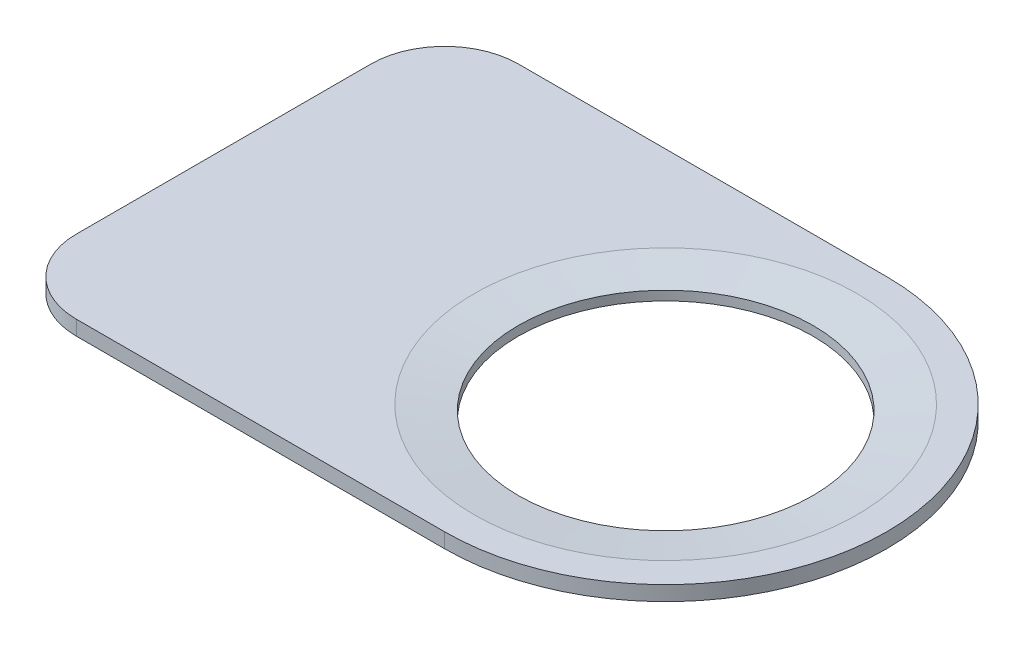
ISO-10303-21;
HEADER;
FILE_DESCRIPTION(('STEP AP214'),'2;1');
FILE_NAME('part.step','',(''),(''),'','','');
FILE_SCHEMA(('AUTOMOTIVE_DESIGN { 1 0 10303 214 1 1 1 1 }'));
ENDSEC;
DATA;
#1=APPLICATION_CONTEXT('core data for automotive mechanical design processes');
#2=APPLICATION_PROTOCOL_DEFINITION('international standard','automotive_design',2000,#1);
#3=PRODUCT_CONTEXT('',#1,'mechanical');
#4=PRODUCT('Part','Part','',(#3));
#5=PRODUCT_RELATED_PRODUCT_CATEGORY('part','',(#4));
#6=PRODUCT_DEFINITION_FORMATION('','',#4);
#7=PRODUCT_DEFINITION_CONTEXT('part definition',#1,'design');
#8=PRODUCT_DEFINITION('design','',#6,#7);
#9=PRODUCT_DEFINITION_SHAPE('','',#8);
#10=(LENGTH_UNIT() NAMED_UNIT(*) SI_UNIT(.MILLI.,.METRE.));
#11=(NAMED_UNIT(*) PLANE_ANGLE_UNIT() SI_UNIT($,.RADIAN.));
#12=(NAMED_UNIT(*) SI_UNIT($,.STERADIAN.) SOLID_ANGLE_UNIT());
#13=UNCERTAINTY_MEASURE_WITH_UNIT(LENGTH_MEASURE(1.E-05),#10,'distance_accuracy_value','');
#14=(GEOMETRIC_REPRESENTATION_CONTEXT(3) GLOBAL_UNCERTAINTY_ASSIGNED_CONTEXT((#13)) GLOBAL_UNIT_ASSIGNED_CONTEXT((#10,
#11,#12)) REPRESENTATION_CONTEXT('',''));
#15=CARTESIAN_POINT('',(0.,0.,0.));
#16=DIRECTION('',(0.,0.,1.));
#17=DIRECTION('',(1.,0.,0.));
#18=AXIS2_PLACEMENT_3D('',#15,#16,#17);
#19=CARTESIAN_POINT('',(0.,1.,15.));
#20=DIRECTION('',(0.,0.,1.));
#21=DIRECTION('',(1.,0.,0.));
#22=AXIS2_PLACEMENT_3D('',#19,#20,#21);
#23=PLANE('',#22);
#24=DIRECTION('',(-1.,0.,0.));
#25=VECTOR('',#24,1.);
#26=CARTESIAN_POINT('',(0.,0.,15.));
#27=LINE('',#26,#25);
#28=CARTESIAN_POINT('',(0.,0.,15.));
#29=VERTEX_POINT('',#28);
#30=CARTESIAN_POINT('',(-25.,0.,15.));
#31=VERTEX_POINT('',#30);
#32=EDGE_CURVE('E120',#29,#31,#27,.T.);
#33=ORIENTED_EDGE('',*,*,#32,.F.);
#34=DIRECTION('',(0.,-1.,0.));
#35=VECTOR('',#34,1.);
#36=CARTESIAN_POINT('',(0.,1.,15.));
#37=LINE('',#36,#35);
#38=CARTESIAN_POINT('',(0.,1.,15.));
#39=VERTEX_POINT('',#38);
#40=EDGE_CURVE('E82',#39,#29,#37,.T.);
#41=ORIENTED_EDGE('',*,*,#40,.F.);
#42=DIRECTION('',(-1.,0.,0.));
#43=VECTOR('',#42,1.);
#44=CARTESIAN_POINT('',(0.,1.,15.));
#45=LINE('',#44,#43);
#46=CARTESIAN_POINT('',(-25.,1.,15.));
#47=VERTEX_POINT('',#46);
#48=EDGE_CURVE('E135',#39,#47,#45,.T.);
#49=ORIENTED_EDGE('',*,*,#48,.T.);
#50=DIRECTION('',(0.,-1.,0.));
#51=VECTOR('',#50,1.);
#52=CARTESIAN_POINT('',(-25.,1.,15.));
#53=LINE('',#52,#51);
#54=EDGE_CURVE('E52',#47,#31,#53,.T.);
#55=ORIENTED_EDGE('',*,*,#54,.T.);
#56=EDGE_LOOP('',(#33,#41,#49,#55));
#57=FACE_BOUND('',#56,.T.);
#58=ADVANCED_FACE('F35',(#57),#23,.T.);
#59=CARTESIAN_POINT('',(0.,1.,0.));
#60=DIRECTION('',(0.,-1.,0.));
#61=DIRECTION('',(0.,0.,-1.));
#62=AXIS2_PLACEMENT_3D('',#59,#60,#61);
#63=CYLINDRICAL_SURFACE('',#62,15.);
#64=CARTESIAN_POINT('',(0.,0.,0.));
#65=DIRECTION('',(0.,1.,0.));
#66=DIRECTION('',(0.,0.,1.));
#67=AXIS2_PLACEMENT_3D('',#64,#65,#66);
#68=CIRCLE('',#67,15.);
#69=CARTESIAN_POINT('',(0.,0.,-15.));
#70=VERTEX_POINT('',#69);
#71=EDGE_CURVE('E122',#29,#70,#68,.T.);
#72=ORIENTED_EDGE('',*,*,#71,.T.);
#73=DIRECTION('',(0.,-1.,0.));
#74=VECTOR('',#73,1.);
#75=CARTESIAN_POINT('',(0.,1.,-15.));
#76=LINE('',#75,#74);
#77=CARTESIAN_POINT('',(0.,1.,-15.));
#78=VERTEX_POINT('',#77);
#79=EDGE_CURVE('E139',#78,#70,#76,.T.);
#80=ORIENTED_EDGE('',*,*,#79,.F.);
#81=CARTESIAN_POINT('',(0.,1.,0.));
#82=DIRECTION('',(0.,1.,0.));
#83=DIRECTION('',(0.,0.,1.));
#84=AXIS2_PLACEMENT_3D('',#81,#82,#83);
#85=CIRCLE('',#84,15.);
#86=EDGE_CURVE('E246',#39,#78,#85,.T.);
#87=ORIENTED_EDGE('',*,*,#86,.F.);
#88=ORIENTED_EDGE('',*,*,#40,.T.);
#89=EDGE_LOOP('',(#72,#80,#87,#88));
#90=FACE_BOUND('',#89,.T.);
#91=ADVANCED_FACE('F158',(#90),#63,.T.);
#92=CARTESIAN_POINT('',(0.,1.,-15.));
#93=DIRECTION('',(0.,0.,1.));
#94=DIRECTION('',(1.,0.,0.));
#95=AXIS2_PLACEMENT_3D('',#92,#93,#94);
#96=PLANE('',#95);
#97=DIRECTION('',(-1.,0.,0.));
#98=VECTOR('',#97,1.);
#99=CARTESIAN_POINT('',(0.,0.,-15.));
#100=LINE('',#99,#98);
#101=CARTESIAN_POINT('',(-25.,0.,-15.));
#102=VERTEX_POINT('',#101);
#103=EDGE_CURVE('E124',#70,#102,#100,.T.);
#104=ORIENTED_EDGE('',*,*,#103,.T.);
#105=DIRECTION('',(0.,-1.,0.));
#106=VECTOR('',#105,1.);
#107=CARTESIAN_POINT('',(-25.,1.,-15.));
#108=LINE('',#107,#106);
#109=CARTESIAN_POINT('',(-25.,1.,-15.));
#110=VERTEX_POINT('',#109);
#111=EDGE_CURVE('E112',#110,#102,#108,.T.);
#112=ORIENTED_EDGE('',*,*,#111,.F.);
#113=DIRECTION('',(-1.,0.,0.));
#114=VECTOR('',#113,1.);
#115=CARTESIAN_POINT('',(0.,1.,-15.));
#116=LINE('',#115,#114);
#117=EDGE_CURVE('E100',#78,#110,#116,.T.);
#118=ORIENTED_EDGE('',*,*,#117,.F.);
#119=ORIENTED_EDGE('',*,*,#79,.T.);
#120=EDGE_LOOP('',(#104,#112,#118,#119));
#121=FACE_BOUND('',#120,.T.);
#122=ADVANCED_FACE('F162',(#121),#96,.F.);
#123=CARTESIAN_POINT('',(-25.,1.,-10.));
#124=DIRECTION('',(0.,-1.,0.));
#125=DIRECTION('',(0.,0.,-1.));
#126=AXIS2_PLACEMENT_3D('',#123,#124,#125);
#127=CYLINDRICAL_SURFACE('',#126,5.);
#128=CARTESIAN_POINT('',(-25.,0.,-10.));
#129=DIRECTION('',(0.,1.,0.));
#130=DIRECTION('',(0.,0.,1.));
#131=AXIS2_PLACEMENT_3D('',#128,#129,#130);
#132=CIRCLE('',#131,5.);
#133=CARTESIAN_POINT('',(-30.,0.,-9.99999999999996));
#134=VERTEX_POINT('',#133);
#135=EDGE_CURVE('E109',#102,#134,#132,.T.);
#136=ORIENTED_EDGE('',*,*,#135,.T.);
#137=DIRECTION('',(0.,-1.,0.));
#138=VECTOR('',#137,1.);
#139=CARTESIAN_POINT('',(-30.,1.,-9.99999999999996));
#140=LINE('',#139,#138);
#141=CARTESIAN_POINT('',(-30.,1.,-9.99999999999996));
#142=VERTEX_POINT('',#141);
#143=EDGE_CURVE('E106',#142,#134,#140,.T.);
#144=ORIENTED_EDGE('',*,*,#143,.F.);
#145=CARTESIAN_POINT('',(-25.,1.,-10.));
#146=DIRECTION('',(0.,1.,0.));
#147=DIRECTION('',(0.,0.,1.));
#148=AXIS2_PLACEMENT_3D('',#145,#146,#147);
#149=CIRCLE('',#148,5.);
#150=EDGE_CURVE('E92',#110,#142,#149,.T.);
#151=ORIENTED_EDGE('',*,*,#150,.F.);
#152=ORIENTED_EDGE('',*,*,#111,.T.);
#153=EDGE_LOOP('',(#136,#144,#151,#152));
#154=FACE_BOUND('',#153,.T.);
#155=ADVANCED_FACE('F107',(#154),#127,.T.);
#156=CARTESIAN_POINT('',(-30.,1.,0.));
#157=DIRECTION('',(1.,0.,0.));
#158=DIRECTION('',(0.,0.,-1.));
#159=AXIS2_PLACEMENT_3D('',#156,#157,#158);
#160=PLANE('',#159);
#161=DIRECTION('',(0.,0.,1.));
#162=VECTOR('',#161,1.);
#163=CARTESIAN_POINT('',(-30.,0.,0.));
#164=LINE('',#163,#162);
#165=CARTESIAN_POINT('',(-30.,0.,9.99999999999997));
#166=VERTEX_POINT('',#165);
#167=EDGE_CURVE('E127',#134,#166,#164,.T.);
#168=ORIENTED_EDGE('',*,*,#167,.T.);
#169=DIRECTION('',(0.,-1.,0.));
#170=VECTOR('',#169,1.);
#171=CARTESIAN_POINT('',(-30.,1.,9.99999999999997));
#172=LINE('',#171,#170);
#173=CARTESIAN_POINT('',(-30.,1.,9.99999999999997));
#174=VERTEX_POINT('',#173);
#175=EDGE_CURVE('E73',#174,#166,#172,.T.);
#176=ORIENTED_EDGE('',*,*,#175,.F.);
#177=DIRECTION('',(0.,0.,1.));
#178=VECTOR('',#177,1.);
#179=CARTESIAN_POINT('',(-30.,1.,0.));
#180=LINE('',#179,#178);
#181=EDGE_CURVE('E98',#142,#174,#180,.T.);
#182=ORIENTED_EDGE('',*,*,#181,.F.);
#183=ORIENTED_EDGE('',*,*,#143,.T.);
#184=EDGE_LOOP('',(#168,#176,#182,#183));
#185=FACE_BOUND('',#184,.T.);
#186=ADVANCED_FACE('F114',(#185),#160,.F.);
#187=CARTESIAN_POINT('',(-25.,1.,10.));
#188=DIRECTION('',(0.,-1.,0.));
#189=DIRECTION('',(0.,0.,-1.));
#190=AXIS2_PLACEMENT_3D('',#187,#188,#189);
#191=CYLINDRICAL_SURFACE('',#190,5.);
#192=CARTESIAN_POINT('',(-25.,0.,10.));
#193=DIRECTION('',(0.,1.,0.));
#194=DIRECTION('',(0.,0.,1.));
#195=AXIS2_PLACEMENT_3D('',#192,#193,#194);
#196=CIRCLE('',#195,5.);
#197=EDGE_CURVE('E129',#31,#166,#196,.F.);
#198=ORIENTED_EDGE('',*,*,#197,.F.);
#199=ORIENTED_EDGE('',*,*,#54,.F.);
#200=CARTESIAN_POINT('',(-25.,1.,10.));
#201=DIRECTION('',(0.,1.,0.));
#202=DIRECTION('',(0.,0.,1.));
#203=AXIS2_PLACEMENT_3D('',#200,#201,#202);
#204=CIRCLE('',#203,5.);
#205=EDGE_CURVE('E115',#47,#174,#204,.F.);
#206=ORIENTED_EDGE('',*,*,#205,.T.);
#207=ORIENTED_EDGE('',*,*,#175,.T.);
#208=EDGE_LOOP('',(#198,#199,#206,#207));
#209=FACE_BOUND('',#208,.T.);
#210=ADVANCED_FACE('F173',(#209),#191,.T.);
#211=CARTESIAN_POINT('',(0.,1.,0.));
#212=DIRECTION('',(0.,-1.,0.));
#213=DIRECTION('',(0.,0.,-1.));
#214=AXIS2_PLACEMENT_3D('',#211,#212,#213);
#215=CYLINDRICAL_SURFACE('',#214,10.);
#216=CARTESIAN_POINT('',(0.,0.631646317291282,0.));
#217=DIRECTION('',(0.,1.,0.));
#218=DIRECTION('',(0.,0.,1.));
#219=AXIS2_PLACEMENT_3D('',#216,#217,#218);
#220=CIRCLE('',#219,10.);
#221=CARTESIAN_POINT('',(0.,0.631646317291282,10.));
#222=VERTEX_POINT('',#221);
#223=EDGE_CURVE('E44',#222,#222,#220,.T.);
#224=ORIENTED_EDGE('',*,*,#223,.T.);
#225=EDGE_LOOP('',(#224));
#226=FACE_BOUND('',#225,.T.);
#227=CARTESIAN_POINT('',(0.,0.,0.));
#228=DIRECTION('',(0.,1.,0.));
#229=DIRECTION('',(0.,0.,1.));
#230=AXIS2_PLACEMENT_3D('',#227,#228,#229);
#231=CIRCLE('',#230,10.);
#232=CARTESIAN_POINT('',(0.,0.,10.));
#233=VERTEX_POINT('',#232);
#234=EDGE_CURVE('E132',#233,#233,#231,.T.);
#235=ORIENTED_EDGE('',*,*,#234,.F.);
#236=EDGE_LOOP('',(#235));
#237=FACE_BOUND('',#236,.T.);
#238=ADVANCED_FACE('F145',(#226,#237),#215,.F.);
#239=CARTESIAN_POINT('',(0.,1.,0.));
#240=DIRECTION('',(0.,1.,0.));
#241=DIRECTION('',(0.,0.,1.));
#242=AXIS2_PLACEMENT_3D('',#239,#240,#241);
#243=PLANE('',#242);
#244=CARTESIAN_POINT('',(0.,1.,0.));
#245=DIRECTION('',(0.,1.,0.));
#246=DIRECTION('',(0.,0.,1.));
#247=AXIS2_PLACEMENT_3D('',#244,#245,#246);
#248=CIRCLE('',#247,13.0000000000001);
#249=CARTESIAN_POINT('',(0.,1.,13.0000000000001));
#250=VERTEX_POINT('',#249);
#251=EDGE_CURVE('E11',#250,#250,#248,.F.);
#252=ORIENTED_EDGE('',*,*,#251,.T.);
#253=EDGE_LOOP('',(#252));
#254=FACE_BOUND('',#253,.T.);
#255=ORIENTED_EDGE('',*,*,#48,.F.);
#256=ORIENTED_EDGE('',*,*,#86,.T.);
#257=ORIENTED_EDGE('',*,*,#117,.T.);
#258=ORIENTED_EDGE('',*,*,#150,.T.);
#259=ORIENTED_EDGE('',*,*,#181,.T.);
#260=ORIENTED_EDGE('',*,*,#205,.F.);
#261=EDGE_LOOP('',(#255,#256,#257,#258,#259,#260));
#262=FACE_BOUND('',#261,.T.);
#263=ADVANCED_FACE('F95',(#254,#262),#243,.T.);
#264=CARTESIAN_POINT('',(0.,0.,0.));
#265=DIRECTION('',(0.,1.,0.));
#266=DIRECTION('',(0.,0.,1.));
#267=AXIS2_PLACEMENT_3D('',#264,#265,#266);
#268=PLANE('',#267);
#269=ORIENTED_EDGE('',*,*,#32,.T.);
#270=ORIENTED_EDGE('',*,*,#197,.T.);
#271=ORIENTED_EDGE('',*,*,#167,.F.);
#272=ORIENTED_EDGE('',*,*,#135,.F.);
#273=ORIENTED_EDGE('',*,*,#103,.F.);
#274=ORIENTED_EDGE('',*,*,#71,.F.);
#275=EDGE_LOOP('',(#269,#270,#271,#272,#273,#274));
#276=FACE_BOUND('',#275,.T.);
#277=ORIENTED_EDGE('',*,*,#234,.T.);
#278=EDGE_LOOP('',(#277));
#279=FACE_BOUND('',#278,.T.);
#280=ADVANCED_FACE('F149',(#276,#279),#268,.F.);
#281=CARTESIAN_POINT('',(0.,0.631646317291282,0.));
#282=DIRECTION('',(0.,1.,0.));
#283=DIRECTION('',(0.,0.,1.));
#284=AXIS2_PLACEMENT_3D('',#281,#282,#283);
#285=CONICAL_SURFACE('',#284,10.,1.4486232791553);
#286=CARTESIAN_POINT('',(0.,1.,13.0000000000001));
#287=CARTESIAN_POINT('',(0.,0.996162982471784,12.9687500000001));
#288=CARTESIAN_POINT('',(0.,0.992325964943568,12.9375000000001));
#289=CARTESIAN_POINT('',(0.,0.984651929887136,12.8750000000001));
#290=CARTESIAN_POINT('',(0.,0.980814912358921,12.8437500000001));
#291=CARTESIAN_POINT('',(0.,0.973140877302489,12.7812500000001));
#292=CARTESIAN_POINT('',(0.,0.969303859774273,12.7500000000001));
#293=CARTESIAN_POINT('',(0.,0.961629824717842,12.6875000000001));
#294=CARTESIAN_POINT('',(0.,0.957792807189626,12.6562500000001));
#295=CARTESIAN_POINT('',(0.,0.950118772133194,12.5937500000001));
#296=CARTESIAN_POINT('',(0.,0.946281754604978,12.5625000000001));
#297=CARTESIAN_POINT('',(0.,0.938607719548547,12.5000000000001));
#298=CARTESIAN_POINT('',(0.,0.934770702020331,12.4687500000001));
#299=CARTESIAN_POINT('',(0.,0.927096666963899,12.4062500000001));
#300=CARTESIAN_POINT('',(0.,0.923259649435684,12.3750000000001));
#301=CARTESIAN_POINT('',(0.,0.915585614379252,12.3125000000001));
#302=CARTESIAN_POINT('',(0.,0.911748596851036,12.2812500000001));
#303=CARTESIAN_POINT('',(0.,0.904074561794604,12.2187500000001));
#304=CARTESIAN_POINT('',(0.,0.900237544266389,12.1875000000001));
#305=CARTESIAN_POINT('',(0.,0.892563509209957,12.1250000000001));
#306=CARTESIAN_POINT('',(0.,0.888726491681741,12.0937500000001));
#307=CARTESIAN_POINT('',(0.,0.88105245662531,12.0312500000001));
#308=CARTESIAN_POINT('',(0.,0.877215439097094,12.0000000000001));
#309=CARTESIAN_POINT('',(0.,0.869541404040662,11.9375000000001));
#310=CARTESIAN_POINT('',(0.,0.865704386512446,11.9062500000001));
#311=CARTESIAN_POINT('',(0.,0.858030351456015,11.8437500000001));
#312=CARTESIAN_POINT('',(0.,0.854193333927799,11.8125000000001));
#313=CARTESIAN_POINT('',(0.,0.846519298871367,11.75));
#314=CARTESIAN_POINT('',(0.,0.842682281343152,11.71875));
#315=CARTESIAN_POINT('',(0.,0.83500824628672,11.65625));
#316=CARTESIAN_POINT('',(0.,0.831171228758504,11.625));
#317=CARTESIAN_POINT('',(0.,0.823497193702073,11.5625));
#318=CARTESIAN_POINT('',(0.,0.819660176173857,11.53125));
#319=CARTESIAN_POINT('',(0.,0.811986141117425,11.46875));
#320=CARTESIAN_POINT('',(0.,0.808149123589209,11.4375));
#321=CARTESIAN_POINT('',(0.,0.800475088532778,11.375));
#322=CARTESIAN_POINT('',(0.,0.796638071004562,11.34375));
#323=CARTESIAN_POINT('',(0.,0.78896403594813,11.28125));
#324=CARTESIAN_POINT('',(0.,0.785127018419914,11.25));
#325=CARTESIAN_POINT('',(0.,0.777452983363483,11.1875));
#326=CARTESIAN_POINT('',(0.,0.773615965835267,11.15625));
#327=CARTESIAN_POINT('',(0.,0.765941930778835,11.09375));
#328=CARTESIAN_POINT('',(0.,0.76210491325062,11.0625));
#329=CARTESIAN_POINT('',(0.,0.754430878194188,11.));
#330=CARTESIAN_POINT('',(0.,0.750593860665972,10.96875));
#331=CARTESIAN_POINT('',(0.,0.742919825609541,10.90625));
#332=CARTESIAN_POINT('',(0.,0.739082808081325,10.875));
#333=CARTESIAN_POINT('',(0.,0.731408773024893,10.8125));
#334=CARTESIAN_POINT('',(0.,0.727571755496677,10.78125));
#335=CARTESIAN_POINT('',(0.,0.719897720440246,10.71875));
#336=CARTESIAN_POINT('',(0.,0.71606070291203,10.6875));
#337=CARTESIAN_POINT('',(0.,0.708386667855598,10.625));
#338=CARTESIAN_POINT('',(0.,0.704549650327382,10.59375));
#339=CARTESIAN_POINT('',(0.,0.696875615270951,10.53125));
#340=CARTESIAN_POINT('',(0.,0.693038597742735,10.5));
#341=CARTESIAN_POINT('',(0.,0.685364562686303,10.4375));
#342=CARTESIAN_POINT('',(0.,0.681527545158087,10.40625));
#343=CARTESIAN_POINT('',(0.,0.673853510101656,10.34375));
#344=CARTESIAN_POINT('',(0.,0.67001649257344,10.3125));
#345=CARTESIAN_POINT('',(0.,0.662342457517008,10.25));
#346=CARTESIAN_POINT('',(0.,0.658505439988793,10.21875));
#347=CARTESIAN_POINT('',(0.,0.650831404932361,10.15625));
#348=CARTESIAN_POINT('',(0.,0.646994387404145,10.125));
#349=CARTESIAN_POINT('',(0.,0.639320352347714,10.0625));
#350=CARTESIAN_POINT('',(0.,0.635483334819498,10.03125));
#351=CARTESIAN_POINT('',(0.,0.631646317291282,10.));
#352=B_SPLINE_CURVE_WITH_KNOTS('',3,(#286,#287,#288,#289,#290,#291,#292,#293,#294,#295,#296,
#297,#298,#299,#300,#301,#302,#303,#304,#305,#306,#307,#308,#309,#310,#311,#312,#313,#314,#315,
#316,#317,#318,#319,#320,#321,#322,#323,#324,#325,#326,#327,#328,#329,#330,#331,#332,#333,#334,
#335,#336,#337,#338,#339,#340,#341,#342,#343,#344,#345,#346,#347,#348,#349,#350,#351),
.UNSPECIFIED.,.F.,.F.,(4,2,2,2,2,2,2,2,2,2,2,2,2,2,2,2,2,2,2,2,2,2,2,2,2,2,2,2,2,2,2,2,4),(0.,
0.0944540461367688,0.188908092273539,0.283362138410308,0.377816184547079,0.472270230683848,
0.566724276820618,0.661178322957389,0.755632369094158,0.850086415230928,0.944540461367697,
1.03899450750447,1.13344855364124,1.22790259977801,1.32235664591478,1.41681069205155,
1.51126473818832,1.60571878432509,1.70017283046185,1.79462687659863,1.8890809227354,
1.98353496887216,2.07798901500893,2.1724430611457,2.26689710728247,2.36135115341924,
2.45580519955601,2.55025924569278,2.64471329182955,2.73916733796632,2.83362138410309,
2.92807543023986,3.02252947637663),.UNSPECIFIED.);
#353=EDGE_CURVE('BSEAM37',#250,#222,#352,.T.);
#354=ORIENTED_EDGE('',*,*,#251,.F.);
#355=ORIENTED_EDGE('',*,*,#223,.F.);
#356=ORIENTED_EDGE('',*,*,#353,.T.);
#357=ORIENTED_EDGE('',*,*,#353,.F.);
#358=EDGE_LOOP('',(#354,#356,#355,#357));
#359=FACE_BOUND('',#358,.T.);
#360=ADVANCED_FACE('F37',(#359),#285,.F.);
#361=CLOSED_SHELL('',(#58,#91,#122,#155,#186,#210,#238,#263,#280,#360));
#362=MANIFOLD_SOLID_BREP('B2',#361);
#363=ADVANCED_BREP_SHAPE_REPRESENTATION('',(#18,#362),#14);
#364=SHAPE_DEFINITION_REPRESENTATION(#9,#363);
ENDSEC;
END-ISO-10303-21;
